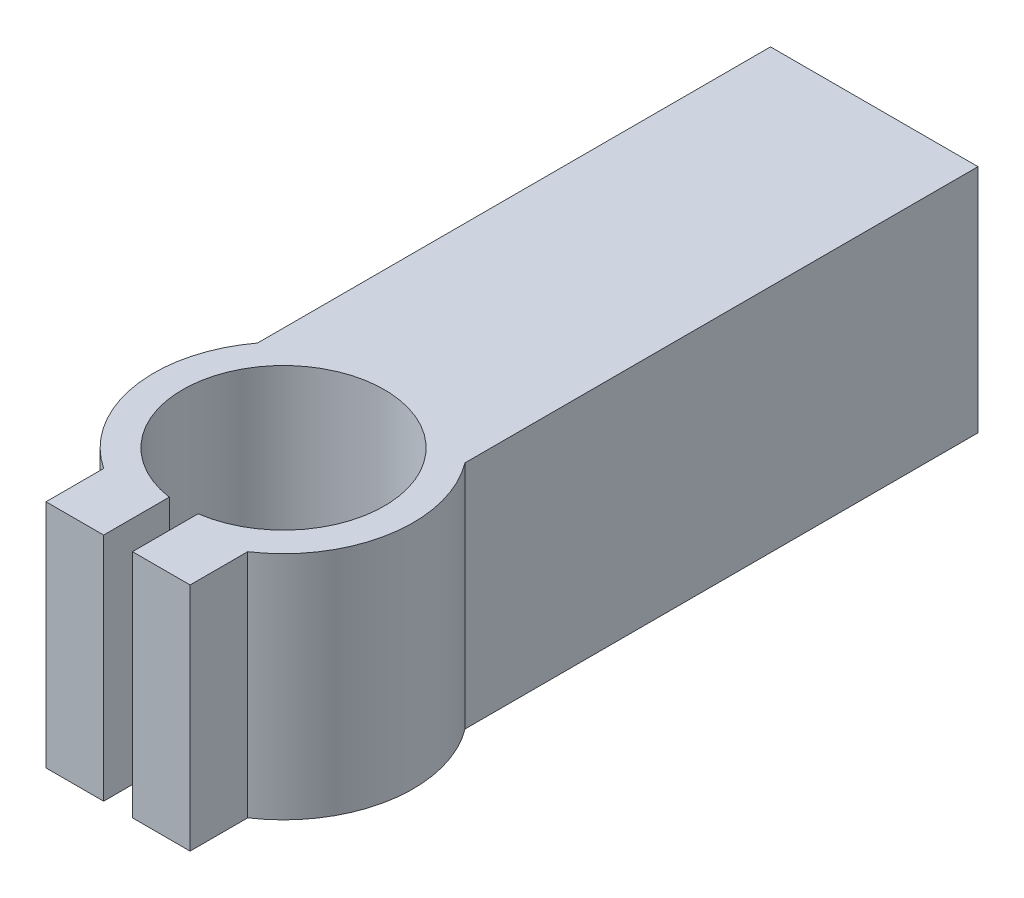
ISO-10303-21;
HEADER;
FILE_DESCRIPTION(('STEP AP214'),'2;1');
FILE_NAME('part.step','',(''),(''),'','','');
FILE_SCHEMA(('AUTOMOTIVE_DESIGN { 1 0 10303 214 1 1 1 1 }'));
ENDSEC;
DATA;
#1=APPLICATION_CONTEXT('core data for automotive mechanical design processes');
#2=APPLICATION_PROTOCOL_DEFINITION('international standard','automotive_design',2000,#1);
#3=PRODUCT_CONTEXT('',#1,'mechanical');
#4=PRODUCT('Part','Part','',(#3));
#5=PRODUCT_RELATED_PRODUCT_CATEGORY('part','',(#4));
#6=PRODUCT_DEFINITION_FORMATION('','',#4);
#7=PRODUCT_DEFINITION_CONTEXT('part definition',#1,'design');
#8=PRODUCT_DEFINITION('design','',#6,#7);
#9=PRODUCT_DEFINITION_SHAPE('','',#8);
#10=(LENGTH_UNIT() NAMED_UNIT(*) SI_UNIT(.MILLI.,.METRE.));
#11=(NAMED_UNIT(*) PLANE_ANGLE_UNIT() SI_UNIT($,.RADIAN.));
#12=(NAMED_UNIT(*) SI_UNIT($,.STERADIAN.) SOLID_ANGLE_UNIT());
#13=UNCERTAINTY_MEASURE_WITH_UNIT(LENGTH_MEASURE(1.E-05),#10,'distance_accuracy_value','');
#14=(GEOMETRIC_REPRESENTATION_CONTEXT(3) GLOBAL_UNCERTAINTY_ASSIGNED_CONTEXT((#13)) GLOBAL_UNIT_ASSIGNED_CONTEXT((#10,
#11,#12)) REPRESENTATION_CONTEXT('',''));
#15=CARTESIAN_POINT('',(0.,0.,0.));
#16=DIRECTION('',(0.,0.,1.));
#17=DIRECTION('',(1.,0.,0.));
#18=AXIS2_PLACEMENT_3D('',#15,#16,#17);
#19=CARTESIAN_POINT('',(0.,50.8,0.));
#20=DIRECTION('',(1.,0.,0.));
#21=DIRECTION('',(0.,0.,-1.));
#22=AXIS2_PLACEMENT_3D('',#19,#20,#21);
#23=PLANE('',#22);
#24=DIRECTION('',(0.,0.,1.));
#25=VECTOR('',#24,1.);
#26=CARTESIAN_POINT('',(0.,0.,0.));
#27=LINE('',#26,#25);
#28=CARTESIAN_POINT('',(0.,0.,-101.6));
#29=VERTEX_POINT('',#28);
#30=CARTESIAN_POINT('',(0.,0.,11.43));
#31=VERTEX_POINT('',#30);
#32=EDGE_CURVE('E206',#29,#31,#27,.T.);
#33=ORIENTED_EDGE('',*,*,#32,.T.);
#34=DIRECTION('',(0.,-1.,0.));
#35=VECTOR('',#34,1.);
#36=CARTESIAN_POINT('',(0.,50.8,11.43));
#37=LINE('',#36,#35);
#38=CARTESIAN_POINT('',(0.,50.8,11.43));
#39=VERTEX_POINT('',#38);
#40=EDGE_CURVE('E190',#39,#31,#37,.T.);
#41=ORIENTED_EDGE('',*,*,#40,.F.);
#42=DIRECTION('',(0.,0.,1.));
#43=VECTOR('',#42,1.);
#44=CARTESIAN_POINT('',(0.,50.8,0.));
#45=LINE('',#44,#43);
#46=CARTESIAN_POINT('',(0.,50.8,-101.6));
#47=VERTEX_POINT('',#46);
#48=EDGE_CURVE('E207',#47,#39,#45,.T.);
#49=ORIENTED_EDGE('',*,*,#48,.F.);
#50=DIRECTION('',(0.,-1.,0.));
#51=VECTOR('',#50,1.);
#52=CARTESIAN_POINT('',(0.,50.8,-101.6));
#53=LINE('',#52,#51);
#54=EDGE_CURVE('E46',#47,#29,#53,.T.);
#55=ORIENTED_EDGE('',*,*,#54,.T.);
#56=EDGE_LOOP('',(#33,#41,#49,#55));
#57=FACE_BOUND('',#56,.T.);
#58=ADVANCED_FACE('F38',(#57),#23,.F.);
#59=CARTESIAN_POINT('',(45.72,50.8,0.));
#60=DIRECTION('',(-1.,0.,0.));
#61=DIRECTION('',(0.,0.,1.));
#62=AXIS2_PLACEMENT_3D('',#59,#60,#61);
#63=PLANE('',#62);
#64=DIRECTION('',(0.,0.,-1.));
#65=VECTOR('',#64,1.);
#66=CARTESIAN_POINT('',(45.72,0.,0.));
#67=LINE('',#66,#65);
#68=CARTESIAN_POINT('',(45.72,0.,11.43));
#69=VERTEX_POINT('',#68);
#70=CARTESIAN_POINT('',(45.72,0.,-101.6));
#71=VERTEX_POINT('',#70);
#72=EDGE_CURVE('E65',#69,#71,#67,.T.);
#73=ORIENTED_EDGE('',*,*,#72,.T.);
#74=DIRECTION('',(0.,-1.,0.));
#75=VECTOR('',#74,1.);
#76=CARTESIAN_POINT('',(45.72,50.8,-101.6));
#77=LINE('',#76,#75);
#78=CARTESIAN_POINT('',(45.72,50.8,-101.6));
#79=VERTEX_POINT('',#78);
#80=EDGE_CURVE('E11',#79,#71,#77,.T.);
#81=ORIENTED_EDGE('',*,*,#80,.F.);
#82=DIRECTION('',(0.,0.,-1.));
#83=VECTOR('',#82,1.);
#84=CARTESIAN_POINT('',(45.72,50.8,0.));
#85=LINE('',#84,#83);
#86=CARTESIAN_POINT('',(45.72,50.8,11.43));
#87=VERTEX_POINT('',#86);
#88=EDGE_CURVE('E209',#87,#79,#85,.T.);
#89=ORIENTED_EDGE('',*,*,#88,.F.);
#90=DIRECTION('',(0.,-1.,0.));
#91=VECTOR('',#90,1.);
#92=CARTESIAN_POINT('',(45.72,50.8,11.43));
#93=LINE('',#92,#91);
#94=EDGE_CURVE('E193',#87,#69,#93,.T.);
#95=ORIENTED_EDGE('',*,*,#94,.T.);
#96=EDGE_LOOP('',(#73,#81,#89,#95));
#97=FACE_BOUND('',#96,.T.);
#98=ADVANCED_FACE('F254',(#97),#63,.F.);
#99=CARTESIAN_POINT('',(0.,50.8,-101.6));
#100=DIRECTION('',(0.,0.,1.));
#101=DIRECTION('',(1.,0.,0.));
#102=AXIS2_PLACEMENT_3D('',#99,#100,#101);
#103=PLANE('',#102);
#104=DIRECTION('',(-1.,0.,0.));
#105=VECTOR('',#104,1.);
#106=CARTESIAN_POINT('',(0.,0.,-101.6));
#107=LINE('',#106,#105);
#108=EDGE_CURVE('E210',#71,#29,#107,.T.);
#109=ORIENTED_EDGE('',*,*,#108,.T.);
#110=ORIENTED_EDGE('',*,*,#54,.F.);
#111=DIRECTION('',(-1.,0.,0.));
#112=VECTOR('',#111,1.);
#113=CARTESIAN_POINT('',(0.,50.8,-101.6));
#114=LINE('',#113,#112);
#115=EDGE_CURVE('E54',#79,#47,#114,.T.);
#116=ORIENTED_EDGE('',*,*,#115,.F.);
#117=ORIENTED_EDGE('',*,*,#80,.T.);
#118=EDGE_LOOP('',(#109,#110,#116,#117));
#119=FACE_BOUND('',#118,.T.);
#120=ADVANCED_FACE('F255',(#119),#103,.F.);
#121=CARTESIAN_POINT('',(0.,50.8,0.));
#122=DIRECTION('',(0.,-1.,0.));
#123=DIRECTION('',(0.,0.,-1.));
#124=AXIS2_PLACEMENT_3D('',#121,#122,#123);
#125=PLANE('',#124);
#126=ORIENTED_EDGE('',*,*,#48,.T.);
#127=CARTESIAN_POINT('',(22.86,50.8,28.575));
#128=DIRECTION('',(0.,-1.,0.));
#129=DIRECTION('',(0.,0.,-1.));
#130=AXIS2_PLACEMENT_3D('',#127,#128,#129);
#131=CIRCLE('',#130,28.575);
#132=CARTESIAN_POINT('',(6.98500000000001,50.8,52.3345244060145));
#133=VERTEX_POINT('',#132);
#134=EDGE_CURVE('E158',#133,#39,#131,.T.);
#135=ORIENTED_EDGE('',*,*,#134,.F.);
#136=DIRECTION('',(0.,0.,-1.));
#137=VECTOR('',#136,1.);
#138=CARTESIAN_POINT('',(6.98499999999999,50.8,65.0345244060145));
#139=LINE('',#138,#137);
#140=CARTESIAN_POINT('',(6.98499999999999,50.8,65.0345244060145));
#141=VERTEX_POINT('',#140);
#142=EDGE_CURVE('E142',#141,#133,#139,.T.);
#143=ORIENTED_EDGE('',*,*,#142,.F.);
#144=DIRECTION('',(-1.,0.,0.));
#145=VECTOR('',#144,1.);
#146=CARTESIAN_POINT('',(19.685,50.8,65.0345244060145));
#147=LINE('',#146,#145);
#148=CARTESIAN_POINT('',(19.685,50.8,65.0345244060145));
#149=VERTEX_POINT('',#148);
#150=EDGE_CURVE('E156',#149,#141,#147,.T.);
#151=ORIENTED_EDGE('',*,*,#150,.F.);
#152=DIRECTION('',(0.,0.,1.));
#153=VECTOR('',#152,1.);
#154=CARTESIAN_POINT('',(19.685,50.8,50.5720452561247));
#155=LINE('',#154,#153);
#156=CARTESIAN_POINT('',(19.685,50.8,50.5720452561247));
#157=VERTEX_POINT('',#156);
#158=EDGE_CURVE('E161',#157,#149,#155,.T.);
#159=ORIENTED_EDGE('',*,*,#158,.F.);
#160=CARTESIAN_POINT('',(22.86,50.8,28.575));
#161=DIRECTION('',(0.,-1.,0.));
#162=DIRECTION('',(0.,0.,-1.));
#163=AXIS2_PLACEMENT_3D('',#160,#161,#162);
#164=CIRCLE('',#163,22.225);
#165=CARTESIAN_POINT('',(26.035,50.8,50.5720452561247));
#166=VERTEX_POINT('',#165);
#167=EDGE_CURVE('E186',#157,#166,#164,.T.);
#168=ORIENTED_EDGE('',*,*,#167,.T.);
#169=DIRECTION('',(0.,0.,1.));
#170=VECTOR('',#169,1.);
#171=CARTESIAN_POINT('',(26.035,50.8,50.5720452561247));
#172=LINE('',#171,#170);
#173=CARTESIAN_POINT('',(26.035,50.8,65.0345244060146));
#174=VERTEX_POINT('',#173);
#175=EDGE_CURVE('E118',#166,#174,#172,.T.);
#176=ORIENTED_EDGE('',*,*,#175,.T.);
#177=DIRECTION('',(1.,0.,0.));
#178=VECTOR('',#177,1.);
#179=CARTESIAN_POINT('',(26.035,50.8,65.0345244060146));
#180=LINE('',#179,#178);
#181=CARTESIAN_POINT('',(38.735,50.8,65.0345244060145));
#182=VERTEX_POINT('',#181);
#183=EDGE_CURVE('E233',#174,#182,#180,.T.);
#184=ORIENTED_EDGE('',*,*,#183,.T.);
#185=DIRECTION('',(0.,0.,-1.));
#186=VECTOR('',#185,1.);
#187=CARTESIAN_POINT('',(38.735,50.8,65.0345244060145));
#188=LINE('',#187,#186);
#189=CARTESIAN_POINT('',(38.735,50.8,52.3345244060145));
#190=VERTEX_POINT('',#189);
#191=EDGE_CURVE('E229',#182,#190,#188,.T.);
#192=ORIENTED_EDGE('',*,*,#191,.T.);
#193=CARTESIAN_POINT('',(22.86,50.8,28.575));
#194=DIRECTION('',(0.,1.,0.));
#195=DIRECTION('',(0.,0.,1.));
#196=AXIS2_PLACEMENT_3D('',#193,#194,#195);
#197=CIRCLE('',#196,28.575);
#198=EDGE_CURVE('E227',#190,#87,#197,.T.);
#199=ORIENTED_EDGE('',*,*,#198,.T.);
#200=ORIENTED_EDGE('',*,*,#88,.T.);
#201=ORIENTED_EDGE('',*,*,#115,.T.);
#202=EDGE_LOOP('',(#126,#135,#143,#151,#159,#168,#176,#184,#192,#199,#200,#201));
#203=FACE_BOUND('',#202,.T.);
#204=ADVANCED_FACE('F154',(#203),#125,.F.);
#205=CARTESIAN_POINT('',(0.,0.,0.));
#206=DIRECTION('',(0.,-1.,0.));
#207=DIRECTION('',(0.,0.,-1.));
#208=AXIS2_PLACEMENT_3D('',#205,#206,#207);
#209=PLANE('',#208);
#210=ORIENTED_EDGE('',*,*,#32,.F.);
#211=ORIENTED_EDGE('',*,*,#108,.F.);
#212=ORIENTED_EDGE('',*,*,#72,.F.);
#213=CARTESIAN_POINT('',(22.86,0.,28.575));
#214=DIRECTION('',(0.,1.,0.));
#215=DIRECTION('',(0.,0.,1.));
#216=AXIS2_PLACEMENT_3D('',#213,#214,#215);
#217=CIRCLE('',#216,28.575);
#218=CARTESIAN_POINT('',(38.735,0.,52.3345244060145));
#219=VERTEX_POINT('',#218);
#220=EDGE_CURVE('E174',#219,#69,#217,.T.);
#221=ORIENTED_EDGE('',*,*,#220,.F.);
#222=DIRECTION('',(0.,0.,-1.));
#223=VECTOR('',#222,1.);
#224=CARTESIAN_POINT('',(38.735,0.,65.0345244060145));
#225=LINE('',#224,#223);
#226=CARTESIAN_POINT('',(38.735,0.,65.0345244060145));
#227=VERTEX_POINT('',#226);
#228=EDGE_CURVE('E172',#227,#219,#225,.T.);
#229=ORIENTED_EDGE('',*,*,#228,.F.);
#230=DIRECTION('',(1.,0.,0.));
#231=VECTOR('',#230,1.);
#232=CARTESIAN_POINT('',(26.035,0.,65.0345244060146));
#233=LINE('',#232,#231);
#234=CARTESIAN_POINT('',(26.035,0.,65.0345244060146));
#235=VERTEX_POINT('',#234);
#236=EDGE_CURVE('E170',#235,#227,#233,.T.);
#237=ORIENTED_EDGE('',*,*,#236,.F.);
#238=DIRECTION('',(0.,0.,1.));
#239=VECTOR('',#238,1.);
#240=CARTESIAN_POINT('',(26.035,0.,50.5720452561247));
#241=LINE('',#240,#239);
#242=CARTESIAN_POINT('',(26.035,0.,50.5720452561247));
#243=VERTEX_POINT('',#242);
#244=EDGE_CURVE('E168',#243,#235,#241,.T.);
#245=ORIENTED_EDGE('',*,*,#244,.F.);
#246=CARTESIAN_POINT('',(22.86,0.,28.575));
#247=DIRECTION('',(0.,-1.,0.));
#248=DIRECTION('',(0.,0.,-1.));
#249=AXIS2_PLACEMENT_3D('',#246,#247,#248);
#250=CIRCLE('',#249,22.225);
#251=CARTESIAN_POINT('',(19.685,0.,50.5720452561247));
#252=VERTEX_POINT('',#251);
#253=EDGE_CURVE('E166',#252,#243,#250,.T.);
#254=ORIENTED_EDGE('',*,*,#253,.F.);
#255=DIRECTION('',(0.,0.,1.));
#256=VECTOR('',#255,1.);
#257=CARTESIAN_POINT('',(19.685,0.,50.5720452561247));
#258=LINE('',#257,#256);
#259=CARTESIAN_POINT('',(19.685,0.,65.0345244060145));
#260=VERTEX_POINT('',#259);
#261=EDGE_CURVE('E183',#252,#260,#258,.T.);
#262=ORIENTED_EDGE('',*,*,#261,.T.);
#263=DIRECTION('',(-1.,0.,0.));
#264=VECTOR('',#263,1.);
#265=CARTESIAN_POINT('',(19.685,0.,65.0345244060145));
#266=LINE('',#265,#264);
#267=CARTESIAN_POINT('',(6.98499999999999,0.,65.0345244060145));
#268=VERTEX_POINT('',#267);
#269=EDGE_CURVE('E181',#260,#268,#266,.T.);
#270=ORIENTED_EDGE('',*,*,#269,.T.);
#271=DIRECTION('',(0.,0.,-1.));
#272=VECTOR('',#271,1.);
#273=CARTESIAN_POINT('',(6.98499999999999,0.,65.0345244060145));
#274=LINE('',#273,#272);
#275=CARTESIAN_POINT('',(6.98500000000001,0.,52.3345244060145));
#276=VERTEX_POINT('',#275);
#277=EDGE_CURVE('E144',#268,#276,#274,.T.);
#278=ORIENTED_EDGE('',*,*,#277,.T.);
#279=CARTESIAN_POINT('',(22.86,0.,28.575));
#280=DIRECTION('',(0.,-1.,0.));
#281=DIRECTION('',(0.,0.,-1.));
#282=AXIS2_PLACEMENT_3D('',#279,#280,#281);
#283=CIRCLE('',#282,28.575);
#284=EDGE_CURVE('E177',#276,#31,#283,.T.);
#285=ORIENTED_EDGE('',*,*,#284,.T.);
#286=EDGE_LOOP('',(#210,#211,#212,#221,#229,#237,#245,#254,#262,#270,#278,#285));
#287=FACE_BOUND('',#286,.T.);
#288=ADVANCED_FACE('F223',(#287),#209,.T.);
#289=CARTESIAN_POINT('',(22.86,50.8,28.575));
#290=DIRECTION('',(0.,-1.,0.));
#291=DIRECTION('',(0.,0.,-1.));
#292=AXIS2_PLACEMENT_3D('',#289,#290,#291);
#293=CYLINDRICAL_SURFACE('',#292,22.225);
#294=ORIENTED_EDGE('',*,*,#253,.T.);
#295=DIRECTION('',(0.,-1.,0.));
#296=VECTOR('',#295,1.);
#297=CARTESIAN_POINT('',(26.035,50.8,50.5720452561247));
#298=LINE('',#297,#296);
#299=EDGE_CURVE('E204',#166,#243,#298,.T.);
#300=ORIENTED_EDGE('',*,*,#299,.F.);
#301=ORIENTED_EDGE('',*,*,#167,.F.);
#302=DIRECTION('',(0.,-1.,0.));
#303=VECTOR('',#302,1.);
#304=CARTESIAN_POINT('',(19.685,50.8,50.5720452561247));
#305=LINE('',#304,#303);
#306=EDGE_CURVE('E74',#157,#252,#305,.T.);
#307=ORIENTED_EDGE('',*,*,#306,.T.);
#308=EDGE_LOOP('',(#294,#300,#301,#307));
#309=FACE_BOUND('',#308,.T.);
#310=ADVANCED_FACE('F237',(#309),#293,.F.);
#311=CARTESIAN_POINT('',(26.035,50.8,50.5720452561247));
#312=DIRECTION('',(1.,0.,0.));
#313=DIRECTION('',(0.,0.,-1.));
#314=AXIS2_PLACEMENT_3D('',#311,#312,#313);
#315=PLANE('',#314);
#316=ORIENTED_EDGE('',*,*,#244,.T.);
#317=DIRECTION('',(0.,-1.,0.));
#318=VECTOR('',#317,1.);
#319=CARTESIAN_POINT('',(26.035,50.8,65.0345244060146));
#320=LINE('',#319,#318);
#321=EDGE_CURVE('E201',#174,#235,#320,.T.);
#322=ORIENTED_EDGE('',*,*,#321,.F.);
#323=ORIENTED_EDGE('',*,*,#175,.F.);
#324=ORIENTED_EDGE('',*,*,#299,.T.);
#325=EDGE_LOOP('',(#316,#322,#323,#324));
#326=FACE_BOUND('',#325,.T.);
#327=ADVANCED_FACE('F238',(#326),#315,.F.);
#328=CARTESIAN_POINT('',(26.035,50.8,65.0345244060146));
#329=DIRECTION('',(0.,0.,-1.));
#330=DIRECTION('',(-1.,0.,0.));
#331=AXIS2_PLACEMENT_3D('',#328,#329,#330);
#332=PLANE('',#331);
#333=ORIENTED_EDGE('',*,*,#236,.T.);
#334=DIRECTION('',(0.,-1.,0.));
#335=VECTOR('',#334,1.);
#336=CARTESIAN_POINT('',(38.735,50.8,65.0345244060145));
#337=LINE('',#336,#335);
#338=EDGE_CURVE('E198',#182,#227,#337,.T.);
#339=ORIENTED_EDGE('',*,*,#338,.F.);
#340=ORIENTED_EDGE('',*,*,#183,.F.);
#341=ORIENTED_EDGE('',*,*,#321,.T.);
#342=EDGE_LOOP('',(#333,#339,#340,#341));
#343=FACE_BOUND('',#342,.T.);
#344=ADVANCED_FACE('F242',(#343),#332,.F.);
#345=CARTESIAN_POINT('',(38.735,50.8,65.0345244060145));
#346=DIRECTION('',(-1.,0.,0.));
#347=DIRECTION('',(0.,0.,1.));
#348=AXIS2_PLACEMENT_3D('',#345,#346,#347);
#349=PLANE('',#348);
#350=ORIENTED_EDGE('',*,*,#228,.T.);
#351=DIRECTION('',(0.,-1.,0.));
#352=VECTOR('',#351,1.);
#353=CARTESIAN_POINT('',(38.735,50.8,52.3345244060145));
#354=LINE('',#353,#352);
#355=EDGE_CURVE('E195',#190,#219,#354,.T.);
#356=ORIENTED_EDGE('',*,*,#355,.F.);
#357=ORIENTED_EDGE('',*,*,#191,.F.);
#358=ORIENTED_EDGE('',*,*,#338,.T.);
#359=EDGE_LOOP('',(#350,#356,#357,#358));
#360=FACE_BOUND('',#359,.T.);
#361=ADVANCED_FACE('F248',(#360),#349,.F.);
#362=CARTESIAN_POINT('',(22.86,50.8,28.575));
#363=DIRECTION('',(0.,-1.,0.));
#364=DIRECTION('',(0.,0.,-1.));
#365=AXIS2_PLACEMENT_3D('',#362,#363,#364);
#366=CYLINDRICAL_SURFACE('',#365,28.575);
#367=ORIENTED_EDGE('',*,*,#220,.T.);
#368=ORIENTED_EDGE('',*,*,#94,.F.);
#369=ORIENTED_EDGE('',*,*,#198,.F.);
#370=ORIENTED_EDGE('',*,*,#355,.T.);
#371=EDGE_LOOP('',(#367,#368,#369,#370));
#372=FACE_BOUND('',#371,.T.);
#373=ADVANCED_FACE('F252',(#372),#366,.T.);
#374=CARTESIAN_POINT('',(22.86,50.8,28.575));
#375=DIRECTION('',(0.,-1.,0.));
#376=DIRECTION('',(0.,0.,-1.));
#377=AXIS2_PLACEMENT_3D('',#374,#375,#376);
#378=CYLINDRICAL_SURFACE('',#377,28.575);
#379=ORIENTED_EDGE('',*,*,#284,.F.);
#380=DIRECTION('',(0.,-1.,0.));
#381=VECTOR('',#380,1.);
#382=CARTESIAN_POINT('',(6.98500000000001,50.8,52.3345244060145));
#383=LINE('',#382,#381);
#384=EDGE_CURVE('E149',#133,#276,#383,.T.);
#385=ORIENTED_EDGE('',*,*,#384,.F.);
#386=ORIENTED_EDGE('',*,*,#134,.T.);
#387=ORIENTED_EDGE('',*,*,#40,.T.);
#388=EDGE_LOOP('',(#379,#385,#386,#387));
#389=FACE_BOUND('',#388,.T.);
#390=ADVANCED_FACE('F226',(#389),#378,.T.);
#391=CARTESIAN_POINT('',(6.98499999999999,50.8,65.0345244060145));
#392=DIRECTION('',(-1.,0.,0.));
#393=DIRECTION('',(0.,0.,1.));
#394=AXIS2_PLACEMENT_3D('',#391,#392,#393);
#395=PLANE('',#394);
#396=ORIENTED_EDGE('',*,*,#277,.F.);
#397=DIRECTION('',(0.,-1.,0.));
#398=VECTOR('',#397,1.);
#399=CARTESIAN_POINT('',(6.98499999999999,50.8,65.0345244060145));
#400=LINE('',#399,#398);
#401=EDGE_CURVE('E139',#141,#268,#400,.T.);
#402=ORIENTED_EDGE('',*,*,#401,.F.);
#403=ORIENTED_EDGE('',*,*,#142,.T.);
#404=ORIENTED_EDGE('',*,*,#384,.T.);
#405=EDGE_LOOP('',(#396,#402,#403,#404));
#406=FACE_BOUND('',#405,.T.);
#407=ADVANCED_FACE('F141',(#406),#395,.T.);
#408=CARTESIAN_POINT('',(19.685,50.8,65.0345244060145));
#409=DIRECTION('',(0.,0.,1.));
#410=DIRECTION('',(1.,0.,0.));
#411=AXIS2_PLACEMENT_3D('',#408,#409,#410);
#412=PLANE('',#411);
#413=ORIENTED_EDGE('',*,*,#269,.F.);
#414=DIRECTION('',(0.,-1.,0.));
#415=VECTOR('',#414,1.);
#416=CARTESIAN_POINT('',(19.685,50.8,65.0345244060145));
#417=LINE('',#416,#415);
#418=EDGE_CURVE('E150',#149,#260,#417,.T.);
#419=ORIENTED_EDGE('',*,*,#418,.F.);
#420=ORIENTED_EDGE('',*,*,#150,.T.);
#421=ORIENTED_EDGE('',*,*,#401,.T.);
#422=EDGE_LOOP('',(#413,#419,#420,#421));
#423=FACE_BOUND('',#422,.T.);
#424=ADVANCED_FACE('F160',(#423),#412,.T.);
#425=CARTESIAN_POINT('',(19.685,50.8,50.5720452561247));
#426=DIRECTION('',(1.,0.,0.));
#427=DIRECTION('',(0.,0.,-1.));
#428=AXIS2_PLACEMENT_3D('',#425,#426,#427);
#429=PLANE('',#428);
#430=ORIENTED_EDGE('',*,*,#261,.F.);
#431=ORIENTED_EDGE('',*,*,#306,.F.);
#432=ORIENTED_EDGE('',*,*,#158,.T.);
#433=ORIENTED_EDGE('',*,*,#418,.T.);
#434=EDGE_LOOP('',(#430,#431,#432,#433));
#435=FACE_BOUND('',#434,.T.);
#436=ADVANCED_FACE('F328',(#435),#429,.T.);
#437=CLOSED_SHELL('',(#58,#98,#120,#204,#288,#310,#327,#344,#361,#373,#390,#407,#424,#436));
#438=MANIFOLD_SOLID_BREP('B2',#437);
#439=ADVANCED_BREP_SHAPE_REPRESENTATION('',(#18,#438),#14);
#440=SHAPE_DEFINITION_REPRESENTATION(#9,#439);
ENDSEC;
END-ISO-10303-21;
